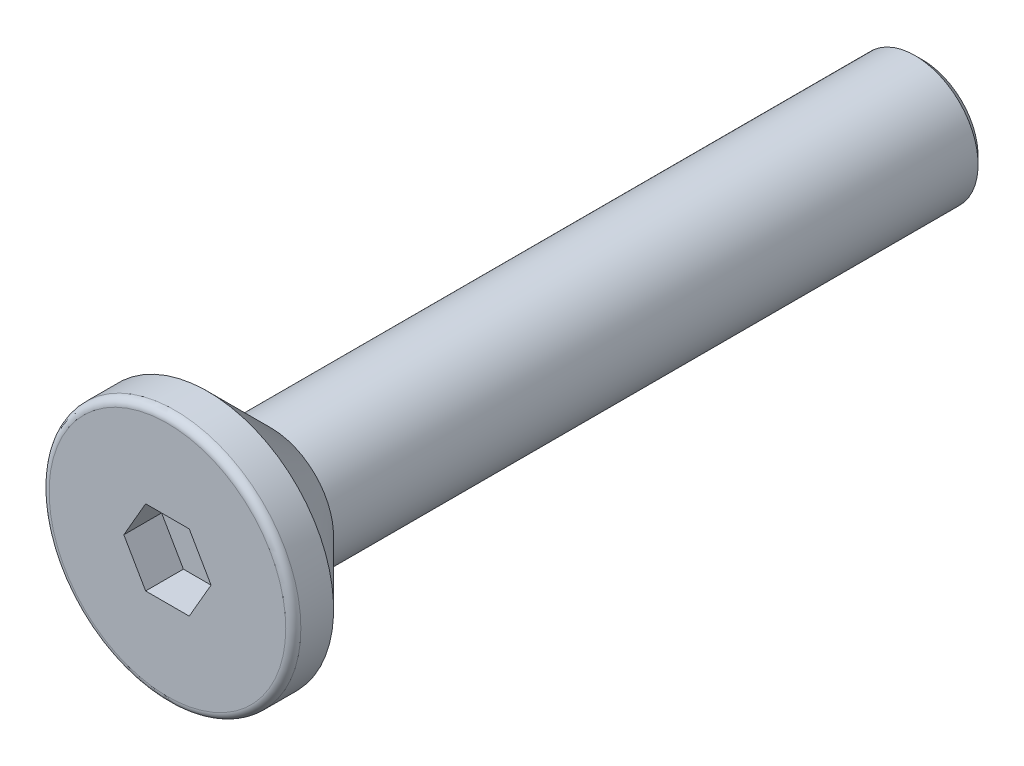
ISO-10303-21;
HEADER;
FILE_DESCRIPTION(('STEP AP214'),'2;1');
FILE_NAME('part.step','',(''),(''),'','','');
FILE_SCHEMA(('AUTOMOTIVE_DESIGN { 1 0 10303 214 1 1 1 1 }'));
ENDSEC;
DATA;
#1=APPLICATION_CONTEXT('core data for automotive mechanical design processes');
#2=APPLICATION_PROTOCOL_DEFINITION('international standard','automotive_design',2000,#1);
#3=PRODUCT_CONTEXT('',#1,'mechanical');
#4=PRODUCT('Part','Part','',(#3));
#5=PRODUCT_RELATED_PRODUCT_CATEGORY('part','',(#4));
#6=PRODUCT_DEFINITION_FORMATION('','',#4);
#7=PRODUCT_DEFINITION_CONTEXT('part definition',#1,'design');
#8=PRODUCT_DEFINITION('design','',#6,#7);
#9=PRODUCT_DEFINITION_SHAPE('','',#8);
#10=(LENGTH_UNIT() NAMED_UNIT(*) SI_UNIT(.MILLI.,.METRE.));
#11=(NAMED_UNIT(*) PLANE_ANGLE_UNIT() SI_UNIT($,.RADIAN.));
#12=(NAMED_UNIT(*) SI_UNIT($,.STERADIAN.) SOLID_ANGLE_UNIT());
#13=UNCERTAINTY_MEASURE_WITH_UNIT(LENGTH_MEASURE(1.E-05),#10,'distance_accuracy_value','');
#14=(GEOMETRIC_REPRESENTATION_CONTEXT(3) GLOBAL_UNCERTAINTY_ASSIGNED_CONTEXT((#13)) GLOBAL_UNIT_ASSIGNED_CONTEXT((#10,
#11,#12)) REPRESENTATION_CONTEXT('',''));
#15=CARTESIAN_POINT('',(0.,0.,0.));
#16=DIRECTION('',(0.,0.,1.));
#17=DIRECTION('',(1.,0.,0.));
#18=AXIS2_PLACEMENT_3D('',#15,#16,#17);
#19=CARTESIAN_POINT('',(0.,0.,15.));
#20=DIRECTION('',(0.,0.,1.));
#21=DIRECTION('',(1.,0.,0.));
#22=AXIS2_PLACEMENT_3D('',#19,#20,#21);
#23=PLANE('',#22);
#24=CARTESIAN_POINT('',(0.,0.,15.));
#25=DIRECTION('',(0.,0.,1.));
#26=DIRECTION('',(1.,0.,0.));
#27=AXIS2_PLACEMENT_3D('',#24,#25,#26);
#28=CIRCLE('',#27,4.7);
#29=CARTESIAN_POINT('',(4.7,0.,15.));
#30=VERTEX_POINT('',#29);
#31=EDGE_CURVE('E11',#30,#30,#28,.T.);
#32=ORIENTED_EDGE('',*,*,#31,.T.);
#33=EDGE_LOOP('',(#32));
#34=FACE_BOUND('',#33,.T.);
#35=DIRECTION('',(0.5,0.866025403784439,0.));
#36=VECTOR('',#35,1.);
#37=CARTESIAN_POINT('',(0.86602540378444,-1.5,15.));
#38=LINE('',#37,#36);
#39=CARTESIAN_POINT('',(0.86602540378444,-1.5,15.));
#40=VERTEX_POINT('',#39);
#41=CARTESIAN_POINT('',(1.73205080756888,0.,15.));
#42=VERTEX_POINT('',#41);
#43=EDGE_CURVE('E48',#40,#42,#38,.T.);
#44=ORIENTED_EDGE('',*,*,#43,.F.);
#45=DIRECTION('',(1.,0.,0.));
#46=VECTOR('',#45,1.);
#47=CARTESIAN_POINT('',(-0.866025403784438,-1.5,15.));
#48=LINE('',#47,#46);
#49=CARTESIAN_POINT('',(-0.866025403784438,-1.5,15.));
#50=VERTEX_POINT('',#49);
#51=EDGE_CURVE('E131',#50,#40,#48,.T.);
#52=ORIENTED_EDGE('',*,*,#51,.F.);
#53=DIRECTION('',(0.5,-0.866025403784438,0.));
#54=VECTOR('',#53,1.);
#55=CARTESIAN_POINT('',(-1.73205080756888,0.,15.));
#56=LINE('',#55,#54);
#57=CARTESIAN_POINT('',(-1.73205080756888,0.,15.));
#58=VERTEX_POINT('',#57);
#59=EDGE_CURVE('E129',#58,#50,#56,.T.);
#60=ORIENTED_EDGE('',*,*,#59,.F.);
#61=DIRECTION('',(-0.5,-0.866025403784438,0.));
#62=VECTOR('',#61,1.);
#63=CARTESIAN_POINT('',(-0.866025403784438,1.5,15.));
#64=LINE('',#63,#62);
#65=CARTESIAN_POINT('',(-0.866025403784438,1.5,15.));
#66=VERTEX_POINT('',#65);
#67=EDGE_CURVE('E96',#66,#58,#64,.T.);
#68=ORIENTED_EDGE('',*,*,#67,.F.);
#69=DIRECTION('',(-1.,0.,0.));
#70=VECTOR('',#69,1.);
#71=CARTESIAN_POINT('',(0.866025403784439,1.5,15.));
#72=LINE('',#71,#70);
#73=CARTESIAN_POINT('',(0.866025403784439,1.5,15.));
#74=VERTEX_POINT('',#73);
#75=EDGE_CURVE('E125',#74,#66,#72,.T.);
#76=ORIENTED_EDGE('',*,*,#75,.F.);
#77=DIRECTION('',(-0.5,0.866025403784438,0.));
#78=VECTOR('',#77,1.);
#79=CARTESIAN_POINT('',(1.73205080756888,0.,15.));
#80=LINE('',#79,#78);
#81=EDGE_CURVE('E122',#42,#74,#80,.T.);
#82=ORIENTED_EDGE('',*,*,#81,.F.);
#83=EDGE_LOOP('',(#44,#52,#60,#68,#76,#82));
#84=FACE_BOUND('',#83,.T.);
#85=ADVANCED_FACE('F33',(#34,#84),#23,.T.);
#86=CARTESIAN_POINT('',(0.,0.,-15.));
#87=DIRECTION('',(0.,0.,-1.));
#88=DIRECTION('',(-1.,0.,0.));
#89=AXIS2_PLACEMENT_3D('',#86,#87,#88);
#90=CYLINDRICAL_SURFACE('',#89,5.);
#91=CARTESIAN_POINT('',(0.,0.,14.7));
#92=DIRECTION('',(0.,0.,1.));
#93=DIRECTION('',(1.,0.,0.));
#94=AXIS2_PLACEMENT_3D('',#91,#92,#93);
#95=CIRCLE('',#94,5.);
#96=CARTESIAN_POINT('',(5.,0.,14.7));
#97=VERTEX_POINT('',#96);
#98=EDGE_CURVE('E41',#97,#97,#95,.F.);
#99=ORIENTED_EDGE('',*,*,#98,.T.);
#100=EDGE_LOOP('',(#99));
#101=FACE_BOUND('',#100,.T.);
#102=CARTESIAN_POINT('',(0.,0.,13.4));
#103=DIRECTION('',(0.,0.,-1.));
#104=DIRECTION('',(-1.,0.,0.));
#105=AXIS2_PLACEMENT_3D('',#102,#103,#104);
#106=CIRCLE('',#105,5.);
#107=CARTESIAN_POINT('',(-5.,0.,13.4));
#108=VERTEX_POINT('',#107);
#109=EDGE_CURVE('E149',#108,#108,#106,.T.);
#110=ORIENTED_EDGE('',*,*,#109,.F.);
#111=EDGE_LOOP('',(#110));
#112=FACE_BOUND('',#111,.T.);
#113=ADVANCED_FACE('F154',(#101,#112),#90,.T.);
#114=CARTESIAN_POINT('',(0.,0.,10.9));
#115=DIRECTION('',(0.,0.,1.));
#116=DIRECTION('',(1.,0.,0.));
#117=AXIS2_PLACEMENT_3D('',#114,#115,#116);
#118=CONICAL_SURFACE('',#117,2.5,0.785398163397443);
#119=ORIENTED_EDGE('',*,*,#109,.T.);
#120=EDGE_LOOP('',(#119));
#121=FACE_BOUND('',#120,.T.);
#122=CARTESIAN_POINT('',(0.,0.,10.9));
#123=DIRECTION('',(0.,0.,-1.));
#124=DIRECTION('',(-1.,0.,0.));
#125=AXIS2_PLACEMENT_3D('',#122,#123,#124);
#126=CIRCLE('',#125,2.5);
#127=CARTESIAN_POINT('',(-2.5,0.,10.9));
#128=VERTEX_POINT('',#127);
#129=EDGE_CURVE('E146',#128,#128,#126,.T.);
#130=ORIENTED_EDGE('',*,*,#129,.F.);
#131=EDGE_LOOP('',(#130));
#132=FACE_BOUND('',#131,.T.);
#133=ADVANCED_FACE('F170',(#121,#132),#118,.T.);
#134=CARTESIAN_POINT('',(0.,0.,-15.));
#135=DIRECTION('',(0.,0.,-1.));
#136=DIRECTION('',(-1.,0.,0.));
#137=AXIS2_PLACEMENT_3D('',#134,#135,#136);
#138=CYLINDRICAL_SURFACE('',#137,2.5);
#139=ORIENTED_EDGE('',*,*,#129,.T.);
#140=EDGE_LOOP('',(#139));
#141=FACE_BOUND('',#140,.T.);
#142=CARTESIAN_POINT('',(0.,0.,-14.7));
#143=DIRECTION('',(0.,0.,-1.));
#144=DIRECTION('',(-1.,0.,0.));
#145=AXIS2_PLACEMENT_3D('',#142,#143,#144);
#146=CIRCLE('',#145,2.5);
#147=CARTESIAN_POINT('',(-2.5,0.,-14.7));
#148=VERTEX_POINT('',#147);
#149=EDGE_CURVE('E143',#148,#148,#146,.T.);
#150=ORIENTED_EDGE('',*,*,#149,.F.);
#151=EDGE_LOOP('',(#150));
#152=FACE_BOUND('',#151,.T.);
#153=ADVANCED_FACE('F176',(#141,#152),#138,.T.);
#154=CARTESIAN_POINT('',(0.,0.,-15.));
#155=DIRECTION('',(0.,0.,1.));
#156=DIRECTION('',(1.,0.,0.));
#157=AXIS2_PLACEMENT_3D('',#154,#155,#156);
#158=CONICAL_SURFACE('',#157,2.2,0.785398163397443);
#159=ORIENTED_EDGE('',*,*,#149,.T.);
#160=EDGE_LOOP('',(#159));
#161=FACE_BOUND('',#160,.T.);
#162=CARTESIAN_POINT('',(0.,0.,-15.));
#163=DIRECTION('',(0.,0.,-1.));
#164=DIRECTION('',(-1.,0.,0.));
#165=AXIS2_PLACEMENT_3D('',#162,#163,#164);
#166=CIRCLE('',#165,2.2);
#167=CARTESIAN_POINT('',(-2.2,0.,-15.));
#168=VERTEX_POINT('',#167);
#169=EDGE_CURVE('E135',#168,#168,#166,.T.);
#170=ORIENTED_EDGE('',*,*,#169,.F.);
#171=EDGE_LOOP('',(#170));
#172=FACE_BOUND('',#171,.T.);
#173=ADVANCED_FACE('F180',(#161,#172),#158,.T.);
#174=CARTESIAN_POINT('',(0.,2.2,-15.));
#175=DIRECTION('',(0.,0.,-1.));
#176=DIRECTION('',(-1.,0.,0.));
#177=AXIS2_PLACEMENT_3D('',#174,#175,#176);
#178=PLANE('',#177);
#179=ORIENTED_EDGE('',*,*,#169,.T.);
#180=EDGE_LOOP('',(#179));
#181=FACE_BOUND('',#180,.T.);
#182=ADVANCED_FACE('F184',(#181),#178,.T.);
#183=CARTESIAN_POINT('',(0.86602540378444,-1.5,13.5));
#184=DIRECTION('',(0.866025403784438,-0.5,0.));
#185=DIRECTION('',(0.5,0.866025403784439,0.));
#186=AXIS2_PLACEMENT_3D('',#183,#184,#185);
#187=PLANE('',#186);
#188=ORIENTED_EDGE('',*,*,#43,.T.);
#189=DIRECTION('',(0.,0.,1.));
#190=VECTOR('',#189,1.);
#191=CARTESIAN_POINT('',(1.73205080756888,0.,13.5));
#192=LINE('',#191,#190);
#193=CARTESIAN_POINT('',(1.73205080756888,0.,13.5));
#194=VERTEX_POINT('',#193);
#195=EDGE_CURVE('E78',#194,#42,#192,.T.);
#196=ORIENTED_EDGE('',*,*,#195,.F.);
#197=DIRECTION('',(0.5,0.866025403784439,0.));
#198=VECTOR('',#197,1.);
#199=CARTESIAN_POINT('',(0.86602540378444,-1.5,13.5));
#200=LINE('',#199,#198);
#201=CARTESIAN_POINT('',(0.86602540378444,-1.5,13.5));
#202=VERTEX_POINT('',#201);
#203=EDGE_CURVE('E133',#202,#194,#200,.T.);
#204=ORIENTED_EDGE('',*,*,#203,.F.);
#205=DIRECTION('',(0.,0.,1.));
#206=VECTOR('',#205,1.);
#207=CARTESIAN_POINT('',(0.86602540378444,-1.5,13.5));
#208=LINE('',#207,#206);
#209=EDGE_CURVE('E56',#202,#40,#208,.T.);
#210=ORIENTED_EDGE('',*,*,#209,.T.);
#211=EDGE_LOOP('',(#188,#196,#204,#210));
#212=FACE_BOUND('',#211,.T.);
#213=ADVANCED_FACE('F188',(#212),#187,.F.);
#214=CARTESIAN_POINT('',(-0.866025403784438,-1.5,13.5));
#215=DIRECTION('',(0.,-1.,0.));
#216=DIRECTION('',(1.,0.,0.));
#217=AXIS2_PLACEMENT_3D('',#214,#215,#216);
#218=PLANE('',#217);
#219=ORIENTED_EDGE('',*,*,#51,.T.);
#220=ORIENTED_EDGE('',*,*,#209,.F.);
#221=DIRECTION('',(1.,0.,0.));
#222=VECTOR('',#221,1.);
#223=CARTESIAN_POINT('',(-0.866025403784438,-1.5,13.5));
#224=LINE('',#223,#222);
#225=CARTESIAN_POINT('',(-0.866025403784438,-1.5,13.5));
#226=VERTEX_POINT('',#225);
#227=EDGE_CURVE('E108',#226,#202,#224,.T.);
#228=ORIENTED_EDGE('',*,*,#227,.F.);
#229=DIRECTION('',(0.,0.,1.));
#230=VECTOR('',#229,1.);
#231=CARTESIAN_POINT('',(-0.866025403784438,-1.5,13.5));
#232=LINE('',#231,#230);
#233=EDGE_CURVE('E100',#226,#50,#232,.T.);
#234=ORIENTED_EDGE('',*,*,#233,.T.);
#235=EDGE_LOOP('',(#219,#220,#228,#234));
#236=FACE_BOUND('',#235,.T.);
#237=ADVANCED_FACE('F192',(#236),#218,.F.);
#238=CARTESIAN_POINT('',(-1.73205080756888,0.,13.5));
#239=DIRECTION('',(-0.866025403784438,-0.5,0.));
#240=DIRECTION('',(0.5,-0.866025403784439,0.));
#241=AXIS2_PLACEMENT_3D('',#238,#239,#240);
#242=PLANE('',#241);
#243=ORIENTED_EDGE('',*,*,#59,.T.);
#244=ORIENTED_EDGE('',*,*,#233,.F.);
#245=DIRECTION('',(0.5,-0.866025403784438,0.));
#246=VECTOR('',#245,1.);
#247=CARTESIAN_POINT('',(-1.73205080756888,0.,13.5));
#248=LINE('',#247,#246);
#249=CARTESIAN_POINT('',(-1.73205080756888,0.,13.5));
#250=VERTEX_POINT('',#249);
#251=EDGE_CURVE('E104',#250,#226,#248,.T.);
#252=ORIENTED_EDGE('',*,*,#251,.F.);
#253=DIRECTION('',(0.,0.,1.));
#254=VECTOR('',#253,1.);
#255=CARTESIAN_POINT('',(-1.73205080756888,0.,13.5));
#256=LINE('',#255,#254);
#257=EDGE_CURVE('E89',#250,#58,#256,.T.);
#258=ORIENTED_EDGE('',*,*,#257,.T.);
#259=EDGE_LOOP('',(#243,#244,#252,#258));
#260=FACE_BOUND('',#259,.T.);
#261=ADVANCED_FACE('F105',(#260),#242,.F.);
#262=CARTESIAN_POINT('',(-0.866025403784438,1.5,13.5));
#263=DIRECTION('',(-0.866025403784439,0.5,0.));
#264=DIRECTION('',(-0.5,-0.866025403784439,0.));
#265=AXIS2_PLACEMENT_3D('',#262,#263,#264);
#266=PLANE('',#265);
#267=ORIENTED_EDGE('',*,*,#67,.T.);
#268=ORIENTED_EDGE('',*,*,#257,.F.);
#269=DIRECTION('',(-0.5,-0.866025403784438,0.));
#270=VECTOR('',#269,1.);
#271=CARTESIAN_POINT('',(-0.866025403784438,1.5,13.5));
#272=LINE('',#271,#270);
#273=CARTESIAN_POINT('',(-0.866025403784438,1.5,13.5));
#274=VERTEX_POINT('',#273);
#275=EDGE_CURVE('E93',#274,#250,#272,.T.);
#276=ORIENTED_EDGE('',*,*,#275,.F.);
#277=DIRECTION('',(0.,0.,1.));
#278=VECTOR('',#277,1.);
#279=CARTESIAN_POINT('',(-0.866025403784438,1.5,13.5));
#280=LINE('',#279,#278);
#281=EDGE_CURVE('E101',#274,#66,#280,.T.);
#282=ORIENTED_EDGE('',*,*,#281,.T.);
#283=EDGE_LOOP('',(#267,#268,#276,#282));
#284=FACE_BOUND('',#283,.T.);
#285=ADVANCED_FACE('F91',(#284),#266,.F.);
#286=CARTESIAN_POINT('',(0.866025403784439,1.5,13.5));
#287=DIRECTION('',(0.,1.,0.));
#288=DIRECTION('',(0.,0.,1.));
#289=AXIS2_PLACEMENT_3D('',#286,#287,#288);
#290=PLANE('',#289);
#291=ORIENTED_EDGE('',*,*,#75,.T.);
#292=ORIENTED_EDGE('',*,*,#281,.F.);
#293=DIRECTION('',(-1.,0.,0.));
#294=VECTOR('',#293,1.);
#295=CARTESIAN_POINT('',(0.866025403784439,1.5,13.5));
#296=LINE('',#295,#294);
#297=CARTESIAN_POINT('',(0.866025403784439,1.5,13.5));
#298=VERTEX_POINT('',#297);
#299=EDGE_CURVE('E114',#298,#274,#296,.T.);
#300=ORIENTED_EDGE('',*,*,#299,.F.);
#301=DIRECTION('',(0.,0.,1.));
#302=VECTOR('',#301,1.);
#303=CARTESIAN_POINT('',(0.866025403784439,1.5,13.5));
#304=LINE('',#303,#302);
#305=EDGE_CURVE('E138',#298,#74,#304,.T.);
#306=ORIENTED_EDGE('',*,*,#305,.T.);
#307=EDGE_LOOP('',(#291,#292,#300,#306));
#308=FACE_BOUND('',#307,.T.);
#309=ADVANCED_FACE('F195',(#308),#290,.F.);
#310=CARTESIAN_POINT('',(1.73205080756888,0.,13.5));
#311=DIRECTION('',(0.866025403784438,0.5,0.));
#312=DIRECTION('',(-0.5,0.866025403784438,0.));
#313=AXIS2_PLACEMENT_3D('',#310,#311,#312);
#314=PLANE('',#313);
#315=ORIENTED_EDGE('',*,*,#81,.T.);
#316=ORIENTED_EDGE('',*,*,#305,.F.);
#317=DIRECTION('',(-0.5,0.866025403784438,0.));
#318=VECTOR('',#317,1.);
#319=CARTESIAN_POINT('',(1.73205080756888,0.,13.5));
#320=LINE('',#319,#318);
#321=EDGE_CURVE('E116',#194,#298,#320,.T.);
#322=ORIENTED_EDGE('',*,*,#321,.F.);
#323=ORIENTED_EDGE('',*,*,#195,.T.);
#324=EDGE_LOOP('',(#315,#316,#322,#323));
#325=FACE_BOUND('',#324,.T.);
#326=ADVANCED_FACE('F162',(#325),#314,.F.);
#327=CARTESIAN_POINT('',(0.,0.,13.5));
#328=DIRECTION('',(0.,0.,1.));
#329=DIRECTION('',(1.,0.,0.));
#330=AXIS2_PLACEMENT_3D('',#327,#328,#329);
#331=PLANE('',#330);
#332=ORIENTED_EDGE('',*,*,#203,.T.);
#333=ORIENTED_EDGE('',*,*,#321,.T.);
#334=ORIENTED_EDGE('',*,*,#299,.T.);
#335=ORIENTED_EDGE('',*,*,#275,.T.);
#336=ORIENTED_EDGE('',*,*,#251,.T.);
#337=ORIENTED_EDGE('',*,*,#227,.T.);
#338=EDGE_LOOP('',(#332,#333,#334,#335,#336,#337));
#339=FACE_BOUND('',#338,.T.);
#340=ADVANCED_FACE('F111',(#339),#331,.T.);
#341=CARTESIAN_POINT('',(0.,0.,14.7));
#342=DIRECTION('',(0.,0.,1.));
#343=DIRECTION('',(1.,0.,0.));
#344=AXIS2_PLACEMENT_3D('',#341,#342,#343);
#345=TOROIDAL_SURFACE('',#344,4.7,0.3);
#346=ORIENTED_EDGE('',*,*,#31,.F.);
#347=EDGE_LOOP('',(#346));
#348=FACE_BOUND('',#347,.T.);
#349=ORIENTED_EDGE('',*,*,#98,.F.);
#350=EDGE_LOOP('',(#349));
#351=FACE_BOUND('',#350,.T.);
#352=ADVANCED_FACE('F35',(#348,#351),#345,.T.);
#353=CLOSED_SHELL('',(#85,#113,#133,#153,#173,#182,#213,#237,#261,#285,#309,#326,#340,#352));
#354=MANIFOLD_SOLID_BREP('B2',#353);
#355=ADVANCED_BREP_SHAPE_REPRESENTATION('',(#18,#354),#14);
#356=SHAPE_DEFINITION_REPRESENTATION(#9,#355);
ENDSEC;
END-ISO-10303-21;
